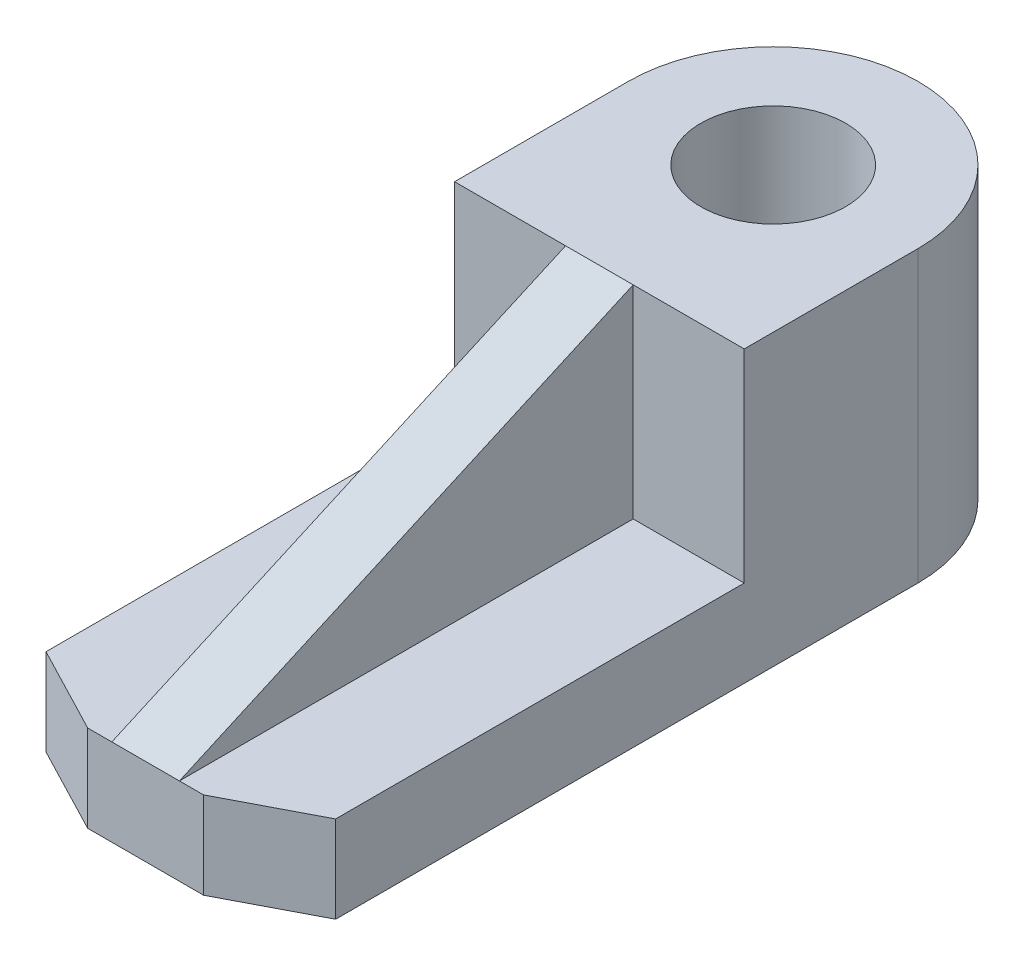
ISO-10303-21;
HEADER;
FILE_DESCRIPTION(('STEP AP214'),'2;1');
FILE_NAME('part.step','',(''),(''),'','','');
FILE_SCHEMA(('AUTOMOTIVE_DESIGN { 1 0 10303 214 1 1 1 1 }'));
ENDSEC;
DATA;
#1=APPLICATION_CONTEXT('core data for automotive mechanical design processes');
#2=APPLICATION_PROTOCOL_DEFINITION('international standard','automotive_design',2000,#1);
#3=PRODUCT_CONTEXT('',#1,'mechanical');
#4=PRODUCT('Part','Part','',(#3));
#5=PRODUCT_RELATED_PRODUCT_CATEGORY('part','',(#4));
#6=PRODUCT_DEFINITION_FORMATION('','',#4);
#7=PRODUCT_DEFINITION_CONTEXT('part definition',#1,'design');
#8=PRODUCT_DEFINITION('design','',#6,#7);
#9=PRODUCT_DEFINITION_SHAPE('','',#8);
#10=(LENGTH_UNIT() NAMED_UNIT(*) SI_UNIT(.MILLI.,.METRE.));
#11=(NAMED_UNIT(*) PLANE_ANGLE_UNIT() SI_UNIT($,.RADIAN.));
#12=(NAMED_UNIT(*) SI_UNIT($,.STERADIAN.) SOLID_ANGLE_UNIT());
#13=UNCERTAINTY_MEASURE_WITH_UNIT(LENGTH_MEASURE(1.E-05),#10,'distance_accuracy_value','');
#14=(GEOMETRIC_REPRESENTATION_CONTEXT(3) GLOBAL_UNCERTAINTY_ASSIGNED_CONTEXT((#13)) GLOBAL_UNIT_ASSIGNED_CONTEXT((#10,
#11,#12)) REPRESENTATION_CONTEXT('',''));
#15=CARTESIAN_POINT('',(0.,0.,0.));
#16=DIRECTION('',(0.,0.,1.));
#17=DIRECTION('',(1.,0.,0.));
#18=AXIS2_PLACEMENT_3D('',#15,#16,#17);
#19=CARTESIAN_POINT('',(0.992805755395675,9.,-65.));
#20=DIRECTION('',(0.,-1.,0.));
#21=DIRECTION('',(0.,0.,-1.));
#22=AXIS2_PLACEMENT_3D('',#19,#20,#21);
#23=PLANE('',#22);
#24=DIRECTION('',(0.,0.,-1.));
#25=VECTOR('',#24,1.);
#26=CARTESIAN_POINT('',(-2.50719424460432,9.,-47.));
#27=LINE('',#26,#25);
#28=CARTESIAN_POINT('',(-2.50719424460432,9.,0.));
#29=VERTEX_POINT('',#28);
#30=CARTESIAN_POINT('',(-2.50719424460432,9.,-47.));
#31=VERTEX_POINT('',#30);
#32=EDGE_CURVE('E235',#29,#31,#27,.T.);
#33=ORIENTED_EDGE('',*,*,#32,.T.);
#34=DIRECTION('',(1.,0.,0.));
#35=VECTOR('',#34,1.);
#36=CARTESIAN_POINT('',(0.,9.,-47.));
#37=LINE('',#36,#35);
#38=CARTESIAN_POINT('',(-14.0071942446043,9.,-47.));
#39=VERTEX_POINT('',#38);
#40=EDGE_CURVE('E62',#39,#31,#37,.T.);
#41=ORIENTED_EDGE('',*,*,#40,.F.);
#42=DIRECTION('',(0.,0.,1.));
#43=VECTOR('',#42,1.);
#44=CARTESIAN_POINT('',(-14.0071942446043,9.,-4.68345323741008));
#45=LINE('',#44,#43);
#46=CARTESIAN_POINT('',(-14.0071942446043,9.,-4.68345323741008));
#47=VERTEX_POINT('',#46);
#48=EDGE_CURVE('E170',#39,#47,#45,.T.);
#49=ORIENTED_EDGE('',*,*,#48,.T.);
#50=DIRECTION('',(0.88707744243177,0.,0.461620635510058));
#51=VECTOR('',#50,1.);
#52=CARTESIAN_POINT('',(-5.00719424460433,9.,0.));
#53=LINE('',#52,#51);
#54=CARTESIAN_POINT('',(-5.00719424460433,9.,0.));
#55=VERTEX_POINT('',#54);
#56=EDGE_CURVE('E159',#47,#55,#53,.T.);
#57=ORIENTED_EDGE('',*,*,#56,.T.);
#58=DIRECTION('',(1.,0.,0.));
#59=VECTOR('',#58,1.);
#60=CARTESIAN_POINT('',(-5.00719424460433,9.,0.));
#61=LINE('',#60,#59);
#62=EDGE_CURVE('E164',#55,#29,#61,.T.);
#63=ORIENTED_EDGE('',*,*,#62,.T.);
#64=EDGE_LOOP('',(#33,#41,#49,#57,#63));
#65=FACE_BOUND('',#64,.T.);
#66=ADVANCED_FACE('F39',(#65),#23,.F.);
#67=CARTESIAN_POINT('',(0.,30.,-47.));
#68=DIRECTION('',(0.,0.,-1.));
#69=DIRECTION('',(-1.,0.,0.));
#70=AXIS2_PLACEMENT_3D('',#67,#68,#69);
#71=PLANE('',#70);
#72=DIRECTION('',(0.,1.,0.));
#73=VECTOR('',#72,1.);
#74=CARTESIAN_POINT('',(-2.50719424460432,30.,-47.));
#75=LINE('',#74,#73);
#76=CARTESIAN_POINT('',(-2.50719424460432,30.,-47.));
#77=VERTEX_POINT('',#76);
#78=EDGE_CURVE('E234',#31,#77,#75,.T.);
#79=ORIENTED_EDGE('',*,*,#78,.T.);
#80=DIRECTION('',(1.,0.,0.));
#81=VECTOR('',#80,1.);
#82=CARTESIAN_POINT('',(0.,30.,-47.));
#83=LINE('',#82,#81);
#84=CARTESIAN_POINT('',(-14.0071942446043,30.,-47.));
#85=VERTEX_POINT('',#84);
#86=EDGE_CURVE('E224',#85,#77,#83,.T.);
#87=ORIENTED_EDGE('',*,*,#86,.F.);
#88=DIRECTION('',(0.,-1.,0.));
#89=VECTOR('',#88,1.);
#90=CARTESIAN_POINT('',(-14.0071942446043,30.,-47.));
#91=LINE('',#90,#89);
#92=EDGE_CURVE('E155',#85,#39,#91,.T.);
#93=ORIENTED_EDGE('',*,*,#92,.T.);
#94=ORIENTED_EDGE('',*,*,#40,.T.);
#95=EDGE_LOOP('',(#79,#87,#93,#94));
#96=FACE_BOUND('',#95,.T.);
#97=ADVANCED_FACE('F239',(#96),#71,.F.);
#98=CARTESIAN_POINT('',(4.49280575539568,9.,-47.));
#99=VERTEX_POINT('',#98);
#100=CARTESIAN_POINT('',(15.9928057553957,9.,-47.));
#101=VERTEX_POINT('',#100);
#102=EDGE_CURVE('E135',#99,#101,#37,.T.);
#103=ORIENTED_EDGE('',*,*,#102,.F.);
#104=DIRECTION('',(0.,0.,-1.));
#105=VECTOR('',#104,1.);
#106=CARTESIAN_POINT('',(4.49280575539568,9.,-47.));
#107=LINE('',#106,#105);
#108=CARTESIAN_POINT('',(4.49280575539568,9.,0.));
#109=VERTEX_POINT('',#108);
#110=EDGE_CURVE('E122',#109,#99,#107,.T.);
#111=ORIENTED_EDGE('',*,*,#110,.F.);
#112=CARTESIAN_POINT('',(6.99280575539568,9.,0.));
#113=VERTEX_POINT('',#112);
#114=EDGE_CURVE('E162',#109,#113,#61,.T.);
#115=ORIENTED_EDGE('',*,*,#114,.T.);
#116=DIRECTION('',(0.88707744243177,0.,-0.461620635510058));
#117=VECTOR('',#116,1.);
#118=CARTESIAN_POINT('',(6.99280575539568,9.,0.));
#119=LINE('',#118,#117);
#120=CARTESIAN_POINT('',(15.9928057553957,9.,-4.68345323741008));
#121=VERTEX_POINT('',#120);
#122=EDGE_CURVE('E167',#113,#121,#119,.T.);
#123=ORIENTED_EDGE('',*,*,#122,.T.);
#124=DIRECTION('',(0.,0.,-1.));
#125=VECTOR('',#124,1.);
#126=CARTESIAN_POINT('',(15.9928057553957,9.,-4.68345323741008));
#127=LINE('',#126,#125);
#128=EDGE_CURVE('E142',#121,#101,#127,.T.);
#129=ORIENTED_EDGE('',*,*,#128,.T.);
#130=EDGE_LOOP('',(#103,#111,#115,#123,#129));
#131=FACE_BOUND('',#130,.T.);
#132=ADVANCED_FACE('F140',(#131),#23,.F.);
#133=CARTESIAN_POINT('',(-5.00719424460433,9.,0.));
#134=DIRECTION('',(0.461620635510058,0.,-0.88707744243177));
#135=DIRECTION('',(-0.88707744243177,0.,-0.461620635510058));
#136=AXIS2_PLACEMENT_3D('',#133,#134,#135);
#137=PLANE('',#136);
#138=DIRECTION('',(0.88707744243177,0.,0.461620635510058));
#139=VECTOR('',#138,1.);
#140=CARTESIAN_POINT('',(-5.00719424460433,0.,0.));
#141=LINE('',#140,#139);
#142=CARTESIAN_POINT('',(-14.0071942446043,0.,-4.68345323741008));
#143=VERTEX_POINT('',#142);
#144=CARTESIAN_POINT('',(-5.00719424460433,0.,0.));
#145=VERTEX_POINT('',#144);
#146=EDGE_CURVE('E158',#143,#145,#141,.T.);
#147=ORIENTED_EDGE('',*,*,#146,.T.);
#148=DIRECTION('',(0.,-1.,0.));
#149=VECTOR('',#148,1.);
#150=CARTESIAN_POINT('',(-5.00719424460433,9.,0.));
#151=LINE('',#150,#149);
#152=EDGE_CURVE('E11',#55,#145,#151,.T.);
#153=ORIENTED_EDGE('',*,*,#152,.F.);
#154=ORIENTED_EDGE('',*,*,#56,.F.);
#155=DIRECTION('',(0.,-1.,0.));
#156=VECTOR('',#155,1.);
#157=CARTESIAN_POINT('',(-14.0071942446043,9.,-4.68345323741008));
#158=LINE('',#157,#156);
#159=EDGE_CURVE('E172',#47,#143,#158,.T.);
#160=ORIENTED_EDGE('',*,*,#159,.T.);
#161=EDGE_LOOP('',(#147,#153,#154,#160));
#162=FACE_BOUND('',#161,.T.);
#163=ADVANCED_FACE('F41',(#162),#137,.F.);
#164=CARTESIAN_POINT('',(-5.00719424460433,9.,0.));
#165=DIRECTION('',(0.,0.,-1.));
#166=DIRECTION('',(-1.,0.,0.));
#167=AXIS2_PLACEMENT_3D('',#164,#165,#166);
#168=PLANE('',#167);
#169=DIRECTION('',(1.,0.,0.));
#170=VECTOR('',#169,1.);
#171=CARTESIAN_POINT('',(-5.00719424460433,0.,0.));
#172=LINE('',#171,#170);
#173=CARTESIAN_POINT('',(6.99280575539568,0.,0.));
#174=VERTEX_POINT('',#173);
#175=EDGE_CURVE('E175',#145,#174,#172,.T.);
#176=ORIENTED_EDGE('',*,*,#175,.T.);
#177=DIRECTION('',(0.,-1.,0.));
#178=VECTOR('',#177,1.);
#179=CARTESIAN_POINT('',(6.99280575539568,9.,0.));
#180=LINE('',#179,#178);
#181=EDGE_CURVE('E47',#113,#174,#180,.T.);
#182=ORIENTED_EDGE('',*,*,#181,.F.);
#183=ORIENTED_EDGE('',*,*,#114,.F.);
#184=DIRECTION('',(-1.,0.,0.));
#185=VECTOR('',#184,1.);
#186=CARTESIAN_POINT('',(4.49280575539568,9.,0.));
#187=LINE('',#186,#185);
#188=EDGE_CURVE('E147',#109,#29,#187,.T.);
#189=ORIENTED_EDGE('',*,*,#188,.T.);
#190=ORIENTED_EDGE('',*,*,#62,.F.);
#191=ORIENTED_EDGE('',*,*,#152,.T.);
#192=EDGE_LOOP('',(#176,#182,#183,#189,#190,#191));
#193=FACE_BOUND('',#192,.T.);
#194=ADVANCED_FACE('F271',(#193),#168,.F.);
#195=CARTESIAN_POINT('',(6.99280575539568,9.,0.));
#196=DIRECTION('',(-0.461620635510058,0.,-0.88707744243177));
#197=DIRECTION('',(-0.88707744243177,0.,0.461620635510059));
#198=AXIS2_PLACEMENT_3D('',#195,#196,#197);
#199=PLANE('',#198);
#200=DIRECTION('',(0.88707744243177,0.,-0.461620635510058));
#201=VECTOR('',#200,1.);
#202=CARTESIAN_POINT('',(6.99280575539568,0.,0.));
#203=LINE('',#202,#201);
#204=CARTESIAN_POINT('',(15.9928057553957,0.,-4.68345323741008));
#205=VERTEX_POINT('',#204);
#206=EDGE_CURVE('E177',#174,#205,#203,.T.);
#207=ORIENTED_EDGE('',*,*,#206,.T.);
#208=DIRECTION('',(0.,-1.,0.));
#209=VECTOR('',#208,1.);
#210=CARTESIAN_POINT('',(15.9928057553957,9.,-4.68345323741008));
#211=LINE('',#210,#209);
#212=EDGE_CURVE('E192',#121,#205,#211,.T.);
#213=ORIENTED_EDGE('',*,*,#212,.F.);
#214=ORIENTED_EDGE('',*,*,#122,.F.);
#215=ORIENTED_EDGE('',*,*,#181,.T.);
#216=EDGE_LOOP('',(#207,#213,#214,#215));
#217=FACE_BOUND('',#216,.T.);
#218=ADVANCED_FACE('F199',(#217),#199,.F.);
#219=CARTESIAN_POINT('',(15.9928057553957,9.,-4.68345323741008));
#220=DIRECTION('',(-1.,0.,0.));
#221=DIRECTION('',(0.,0.,1.));
#222=AXIS2_PLACEMENT_3D('',#219,#220,#221);
#223=PLANE('',#222);
#224=DIRECTION('',(0.,0.,-1.));
#225=VECTOR('',#224,1.);
#226=CARTESIAN_POINT('',(15.9928057553957,0.,-4.68345323741008));
#227=LINE('',#226,#225);
#228=CARTESIAN_POINT('',(15.9928057553957,0.,-65.));
#229=VERTEX_POINT('',#228);
#230=EDGE_CURVE('E179',#205,#229,#227,.T.);
#231=ORIENTED_EDGE('',*,*,#230,.T.);
#232=DIRECTION('',(0.,-1.,0.));
#233=VECTOR('',#232,1.);
#234=CARTESIAN_POINT('',(15.9928057553957,9.,-65.));
#235=LINE('',#234,#233);
#236=CARTESIAN_POINT('',(15.9928057553957,30.,-65.));
#237=VERTEX_POINT('',#236);
#238=EDGE_CURVE('E189',#237,#229,#235,.T.);
#239=ORIENTED_EDGE('',*,*,#238,.F.);
#240=DIRECTION('',(0.,0.,-1.));
#241=VECTOR('',#240,1.);
#242=CARTESIAN_POINT('',(15.9928057553957,30.,0.));
#243=LINE('',#242,#241);
#244=CARTESIAN_POINT('',(15.9928057553957,30.,-47.));
#245=VERTEX_POINT('',#244);
#246=EDGE_CURVE('E151',#245,#237,#243,.T.);
#247=ORIENTED_EDGE('',*,*,#246,.F.);
#248=DIRECTION('',(0.,-1.,0.));
#249=VECTOR('',#248,1.);
#250=CARTESIAN_POINT('',(15.9928057553957,30.,-47.));
#251=LINE('',#250,#249);
#252=EDGE_CURVE('E153',#245,#101,#251,.T.);
#253=ORIENTED_EDGE('',*,*,#252,.T.);
#254=ORIENTED_EDGE('',*,*,#128,.F.);
#255=ORIENTED_EDGE('',*,*,#212,.T.);
#256=EDGE_LOOP('',(#231,#239,#247,#253,#254,#255));
#257=FACE_BOUND('',#256,.T.);
#258=ADVANCED_FACE('F209',(#257),#223,.F.);
#259=CARTESIAN_POINT('',(0.992805755395675,9.,-65.));
#260=DIRECTION('',(0.,-1.,0.));
#261=DIRECTION('',(0.,0.,-1.));
#262=AXIS2_PLACEMENT_3D('',#259,#260,#261);
#263=CYLINDRICAL_SURFACE('',#262,15.);
#264=CARTESIAN_POINT('',(0.992805755395675,0.,-65.));
#265=DIRECTION('',(0.,1.,0.));
#266=DIRECTION('',(0.,0.,-1.));
#267=AXIS2_PLACEMENT_3D('',#264,#265,#266);
#268=CIRCLE('',#267,15.);
#269=CARTESIAN_POINT('',(-14.0071942446043,0.,-65.));
#270=VERTEX_POINT('',#269);
#271=EDGE_CURVE('E181',#229,#270,#268,.T.);
#272=ORIENTED_EDGE('',*,*,#271,.T.);
#273=DIRECTION('',(0.,-1.,0.));
#274=VECTOR('',#273,1.);
#275=CARTESIAN_POINT('',(-14.0071942446043,9.,-65.));
#276=LINE('',#275,#274);
#277=CARTESIAN_POINT('',(-14.0071942446043,30.,-65.));
#278=VERTEX_POINT('',#277);
#279=EDGE_CURVE('E186',#278,#270,#276,.T.);
#280=ORIENTED_EDGE('',*,*,#279,.F.);
#281=CARTESIAN_POINT('',(0.992805755395675,30.,-65.));
#282=DIRECTION('',(0.,1.,0.));
#283=DIRECTION('',(0.,0.,1.));
#284=AXIS2_PLACEMENT_3D('',#281,#282,#283);
#285=CIRCLE('',#284,15.);
#286=EDGE_CURVE('E216',#237,#278,#285,.T.);
#287=ORIENTED_EDGE('',*,*,#286,.F.);
#288=ORIENTED_EDGE('',*,*,#238,.T.);
#289=EDGE_LOOP('',(#272,#280,#287,#288));
#290=FACE_BOUND('',#289,.T.);
#291=ADVANCED_FACE('F214',(#290),#263,.T.);
#292=CARTESIAN_POINT('',(-14.0071942446043,9.,-4.68345323741008));
#293=DIRECTION('',(1.,0.,0.));
#294=DIRECTION('',(0.,0.,-1.));
#295=AXIS2_PLACEMENT_3D('',#292,#293,#294);
#296=PLANE('',#295);
#297=DIRECTION('',(0.,0.,1.));
#298=VECTOR('',#297,1.);
#299=CARTESIAN_POINT('',(-14.0071942446043,0.,-4.68345323741008));
#300=LINE('',#299,#298);
#301=EDGE_CURVE('E163',#270,#143,#300,.T.);
#302=ORIENTED_EDGE('',*,*,#301,.T.);
#303=ORIENTED_EDGE('',*,*,#159,.F.);
#304=ORIENTED_EDGE('',*,*,#48,.F.);
#305=ORIENTED_EDGE('',*,*,#92,.F.);
#306=DIRECTION('',(0.,0.,1.));
#307=VECTOR('',#306,1.);
#308=CARTESIAN_POINT('',(-14.0071942446043,30.,0.));
#309=LINE('',#308,#307);
#310=EDGE_CURVE('E219',#278,#85,#309,.T.);
#311=ORIENTED_EDGE('',*,*,#310,.F.);
#312=ORIENTED_EDGE('',*,*,#279,.T.);
#313=EDGE_LOOP('',(#302,#303,#304,#305,#311,#312));
#314=FACE_BOUND('',#313,.T.);
#315=ADVANCED_FACE('F280',(#314),#296,.F.);
#316=CARTESIAN_POINT('',(0.992805755395675,0.,-65.));
#317=DIRECTION('',(0.,-1.,0.));
#318=DIRECTION('',(0.,0.,-1.));
#319=AXIS2_PLACEMENT_3D('',#316,#317,#318);
#320=PLANE('',#319);
#321=CARTESIAN_POINT('',(0.992805755395674,0.,-65.));
#322=DIRECTION('',(0.,1.,0.));
#323=DIRECTION('',(0.,0.,1.));
#324=AXIS2_PLACEMENT_3D('',#321,#322,#323);
#325=CIRCLE('',#324,7.5);
#326=CARTESIAN_POINT('',(0.992805755395674,0.,-72.5));
#327=VERTEX_POINT('',#326);
#328=EDGE_CURVE('E241',#327,#327,#325,.T.);
#329=ORIENTED_EDGE('',*,*,#328,.T.);
#330=EDGE_LOOP('',(#329));
#331=FACE_BOUND('',#330,.T.);
#332=ORIENTED_EDGE('',*,*,#146,.F.);
#333=ORIENTED_EDGE('',*,*,#301,.F.);
#334=ORIENTED_EDGE('',*,*,#271,.F.);
#335=ORIENTED_EDGE('',*,*,#230,.F.);
#336=ORIENTED_EDGE('',*,*,#206,.F.);
#337=ORIENTED_EDGE('',*,*,#175,.F.);
#338=EDGE_LOOP('',(#332,#333,#334,#335,#336,#337));
#339=FACE_BOUND('',#338,.T.);
#340=ADVANCED_FACE('F205',(#331,#339),#320,.T.);
#341=CARTESIAN_POINT('',(4.49280575539568,30.,-47.));
#342=VERTEX_POINT('',#341);
#343=EDGE_CURVE('E137',#342,#245,#83,.T.);
#344=ORIENTED_EDGE('',*,*,#343,.F.);
#345=DIRECTION('',(0.,1.,0.));
#346=VECTOR('',#345,1.);
#347=CARTESIAN_POINT('',(4.49280575539568,30.,-47.));
#348=LINE('',#347,#346);
#349=EDGE_CURVE('E125',#99,#342,#348,.T.);
#350=ORIENTED_EDGE('',*,*,#349,.F.);
#351=ORIENTED_EDGE('',*,*,#102,.T.);
#352=ORIENTED_EDGE('',*,*,#252,.F.);
#353=EDGE_LOOP('',(#344,#350,#351,#352));
#354=FACE_BOUND('',#353,.T.);
#355=ADVANCED_FACE('F133',(#354),#71,.F.);
#356=CARTESIAN_POINT('',(0.992805755395674,30.,-65.));
#357=DIRECTION('',(0.,-1.,0.));
#358=DIRECTION('',(0.,0.,-1.));
#359=AXIS2_PLACEMENT_3D('',#356,#357,#358);
#360=CYLINDRICAL_SURFACE('',#359,7.5);
#361=CARTESIAN_POINT('',(0.992805755395674,30.,-65.));
#362=DIRECTION('',(0.,1.,0.));
#363=DIRECTION('',(0.,0.,1.));
#364=AXIS2_PLACEMENT_3D('',#361,#362,#363);
#365=CIRCLE('',#364,7.5);
#366=CARTESIAN_POINT('',(0.992805755395674,30.,-72.5));
#367=VERTEX_POINT('',#366);
#368=EDGE_CURVE('E146',#367,#367,#365,.T.);
#369=CARTESIAN_POINT('',(0.992805755395674,30.,-72.5));
#370=CARTESIAN_POINT('',(0.992805755395674,29.6875,-72.5));
#371=CARTESIAN_POINT('',(0.992805755395674,29.375,-72.5));
#372=CARTESIAN_POINT('',(0.992805755395674,28.75,-72.5));
#373=CARTESIAN_POINT('',(0.992805755395674,28.4375,-72.5));
#374=CARTESIAN_POINT('',(0.992805755395674,27.8125,-72.5));
#375=CARTESIAN_POINT('',(0.992805755395674,27.5,-72.5));
#376=CARTESIAN_POINT('',(0.992805755395674,26.875,-72.5));
#377=CARTESIAN_POINT('',(0.992805755395674,26.5625,-72.5));
#378=CARTESIAN_POINT('',(0.992805755395674,25.9375,-72.5));
#379=CARTESIAN_POINT('',(0.992805755395674,25.625,-72.5));
#380=CARTESIAN_POINT('',(0.992805755395674,25.,-72.5));
#381=CARTESIAN_POINT('',(0.992805755395674,24.6875,-72.5));
#382=CARTESIAN_POINT('',(0.992805755395674,24.0625,-72.5));
#383=CARTESIAN_POINT('',(0.992805755395674,23.75,-72.5));
#384=CARTESIAN_POINT('',(0.992805755395674,23.125,-72.5));
#385=CARTESIAN_POINT('',(0.992805755395674,22.8125,-72.5));
#386=CARTESIAN_POINT('',(0.992805755395674,22.1875,-72.5));
#387=CARTESIAN_POINT('',(0.992805755395674,21.875,-72.5));
#388=CARTESIAN_POINT('',(0.992805755395674,21.25,-72.5));
#389=CARTESIAN_POINT('',(0.992805755395674,20.9375,-72.5));
#390=CARTESIAN_POINT('',(0.992805755395674,20.3125,-72.5));
#391=CARTESIAN_POINT('',(0.992805755395674,20.,-72.5));
#392=CARTESIAN_POINT('',(0.992805755395674,19.375,-72.5));
#393=CARTESIAN_POINT('',(0.992805755395674,19.0625,-72.5));
#394=CARTESIAN_POINT('',(0.992805755395674,18.4375,-72.5));
#395=CARTESIAN_POINT('',(0.992805755395674,18.125,-72.5));
#396=CARTESIAN_POINT('',(0.992805755395674,17.5,-72.5));
#397=CARTESIAN_POINT('',(0.992805755395674,17.1875,-72.5));
#398=CARTESIAN_POINT('',(0.992805755395674,16.5625,-72.5));
#399=CARTESIAN_POINT('',(0.992805755395674,16.25,-72.5));
#400=CARTESIAN_POINT('',(0.992805755395674,15.625,-72.5));
#401=CARTESIAN_POINT('',(0.992805755395674,15.3125,-72.5));
#402=CARTESIAN_POINT('',(0.992805755395674,14.6875,-72.5));
#403=CARTESIAN_POINT('',(0.992805755395674,14.375,-72.5));
#404=CARTESIAN_POINT('',(0.992805755395674,13.75,-72.5));
#405=CARTESIAN_POINT('',(0.992805755395674,13.4375,-72.5));
#406=CARTESIAN_POINT('',(0.992805755395674,12.8125,-72.5));
#407=CARTESIAN_POINT('',(0.992805755395674,12.5,-72.5));
#408=CARTESIAN_POINT('',(0.992805755395674,11.875,-72.5));
#409=CARTESIAN_POINT('',(0.992805755395674,11.5625,-72.5));
#410=CARTESIAN_POINT('',(0.992805755395674,10.9375,-72.5));
#411=CARTESIAN_POINT('',(0.992805755395674,10.625,-72.5));
#412=CARTESIAN_POINT('',(0.992805755395674,10.,-72.5));
#413=CARTESIAN_POINT('',(0.992805755395674,9.6875,-72.5));
#414=CARTESIAN_POINT('',(0.992805755395674,9.0625,-72.5));
#415=CARTESIAN_POINT('',(0.992805755395674,8.75,-72.5));
#416=CARTESIAN_POINT('',(0.992805755395674,8.125,-72.5));
#417=CARTESIAN_POINT('',(0.992805755395674,7.8125,-72.5));
#418=CARTESIAN_POINT('',(0.992805755395674,7.1875,-72.5));
#419=CARTESIAN_POINT('',(0.992805755395674,6.875,-72.5));
#420=CARTESIAN_POINT('',(0.992805755395674,6.25,-72.5));
#421=CARTESIAN_POINT('',(0.992805755395674,5.9375,-72.5));
#422=CARTESIAN_POINT('',(0.992805755395674,5.3125,-72.5));
#423=CARTESIAN_POINT('',(0.992805755395674,5.,-72.5));
#424=CARTESIAN_POINT('',(0.992805755395674,4.375,-72.5));
#425=CARTESIAN_POINT('',(0.992805755395674,4.0625,-72.5));
#426=CARTESIAN_POINT('',(0.992805755395674,3.4375,-72.5));
#427=CARTESIAN_POINT('',(0.992805755395674,3.125,-72.5));
#428=CARTESIAN_POINT('',(0.992805755395674,2.5,-72.5));
#429=CARTESIAN_POINT('',(0.992805755395674,2.1875,-72.5));
#430=CARTESIAN_POINT('',(0.992805755395674,1.5625,-72.5));
#431=CARTESIAN_POINT('',(0.992805755395674,1.25,-72.5));
#432=CARTESIAN_POINT('',(0.992805755395674,0.624999999999997,-72.5));
#433=CARTESIAN_POINT('',(0.992805755395674,0.312499999999997,-72.5));
#434=CARTESIAN_POINT('',(0.992805755395674,0.,-72.5));
#435=B_SPLINE_CURVE_WITH_KNOTS('',3,(#369,#370,#371,#372,#373,#374,#375,#376,#377,#378,#379,
#380,#381,#382,#383,#384,#385,#386,#387,#388,#389,#390,#391,#392,#393,#394,#395,#396,#397,#398,
#399,#400,#401,#402,#403,#404,#405,#406,#407,#408,#409,#410,#411,#412,#413,#414,#415,#416,#417,
#418,#419,#420,#421,#422,#423,#424,#425,#426,#427,#428,#429,#430,#431,#432,#433,#434),
.UNSPECIFIED.,.F.,.F.,(4,2,2,2,2,2,2,2,2,2,2,2,2,2,2,2,2,2,2,2,2,2,2,2,2,2,2,2,2,2,2,2,4),(0.,
0.937499999999997,1.875,2.8125,3.75,4.6875,5.625,6.5625,7.5,8.4375,9.375,10.3125,11.25,12.1875,
13.125,14.0625,15.,15.9375,16.875,17.8125,18.75,19.6875,20.625,21.5625,22.5,23.4375,24.375,
25.3125,26.25,27.1875,28.125,29.0625,30.),.UNSPECIFIED.);
#436=EDGE_CURVE('BSEAM250',#367,#327,#435,.T.);
#437=ORIENTED_EDGE('',*,*,#368,.T.);
#438=ORIENTED_EDGE('',*,*,#328,.F.);
#439=ORIENTED_EDGE('',*,*,#436,.T.);
#440=ORIENTED_EDGE('',*,*,#436,.F.);
#441=EDGE_LOOP('',(#437,#439,#438,#440));
#442=FACE_BOUND('',#441,.T.);
#443=ADVANCED_FACE('F250',(#442),#360,.F.);
#444=CARTESIAN_POINT('',(0.,30.,0.));
#445=DIRECTION('',(0.,1.,0.));
#446=DIRECTION('',(0.,0.,1.));
#447=AXIS2_PLACEMENT_3D('',#444,#445,#446);
#448=PLANE('',#447);
#449=ORIENTED_EDGE('',*,*,#368,.F.);
#450=EDGE_LOOP('',(#449));
#451=FACE_BOUND('',#450,.T.);
#452=ORIENTED_EDGE('',*,*,#286,.T.);
#453=ORIENTED_EDGE('',*,*,#310,.T.);
#454=ORIENTED_EDGE('',*,*,#86,.T.);
#455=DIRECTION('',(-1.,0.,0.));
#456=VECTOR('',#455,1.);
#457=CARTESIAN_POINT('',(4.49280575539568,30.,-47.));
#458=LINE('',#457,#456);
#459=EDGE_CURVE('E144',#342,#77,#458,.T.);
#460=ORIENTED_EDGE('',*,*,#459,.F.);
#461=ORIENTED_EDGE('',*,*,#343,.T.);
#462=ORIENTED_EDGE('',*,*,#246,.T.);
#463=EDGE_LOOP('',(#452,#453,#454,#460,#461,#462));
#464=FACE_BOUND('',#463,.T.);
#465=ADVANCED_FACE('F227',(#451,#464),#448,.T.);
#466=CARTESIAN_POINT('',(4.49280575539568,9.,0.));
#467=DIRECTION('',(0.,-0.913008710615828,-0.407940062190051));
#468=DIRECTION('',(0.,0.407940062190051,-0.913008710615828));
#469=AXIS2_PLACEMENT_3D('',#466,#467,#468);
#470=PLANE('',#469);
#471=DIRECTION('',(0.,-0.407940062190051,0.913008710615828));
#472=VECTOR('',#471,1.);
#473=CARTESIAN_POINT('',(-2.50719424460432,9.,0.));
#474=LINE('',#473,#472);
#475=EDGE_CURVE('E130',#77,#29,#474,.T.);
#476=ORIENTED_EDGE('',*,*,#475,.T.);
#477=ORIENTED_EDGE('',*,*,#188,.F.);
#478=DIRECTION('',(0.,-0.407940062190051,0.913008710615828));
#479=VECTOR('',#478,1.);
#480=CARTESIAN_POINT('',(4.49280575539568,9.,0.));
#481=LINE('',#480,#479);
#482=EDGE_CURVE('E54',#342,#109,#481,.T.);
#483=ORIENTED_EDGE('',*,*,#482,.F.);
#484=ORIENTED_EDGE('',*,*,#459,.T.);
#485=EDGE_LOOP('',(#476,#477,#483,#484));
#486=FACE_BOUND('',#485,.T.);
#487=ADVANCED_FACE('F229',(#486),#470,.F.);
#488=CARTESIAN_POINT('',(4.49280575539568,0.,0.));
#489=DIRECTION('',(1.,0.,0.));
#490=DIRECTION('',(0.,0.,-1.));
#491=AXIS2_PLACEMENT_3D('',#488,#489,#490);
#492=PLANE('',#491);
#493=ORIENTED_EDGE('',*,*,#110,.T.);
#494=ORIENTED_EDGE('',*,*,#349,.T.);
#495=ORIENTED_EDGE('',*,*,#482,.T.);
#496=EDGE_LOOP('',(#493,#494,#495));
#497=FACE_BOUND('',#496,.T.);
#498=ADVANCED_FACE('F124',(#497),#492,.T.);
#499=CARTESIAN_POINT('',(-2.50719424460432,0.,0.));
#500=DIRECTION('',(1.,0.,0.));
#501=DIRECTION('',(0.,0.,-1.));
#502=AXIS2_PLACEMENT_3D('',#499,#500,#501);
#503=PLANE('',#502);
#504=ORIENTED_EDGE('',*,*,#32,.F.);
#505=ORIENTED_EDGE('',*,*,#475,.F.);
#506=ORIENTED_EDGE('',*,*,#78,.F.);
#507=EDGE_LOOP('',(#504,#505,#506));
#508=FACE_BOUND('',#507,.T.);
#509=ADVANCED_FACE('F233',(#508),#503,.F.);
#510=CLOSED_SHELL('',(#66,#97,#132,#163,#194,#218,#258,#291,#315,#340,#355,#443,#465,#487,#498,#509));
#511=MANIFOLD_SOLID_BREP('B2',#510);
#512=ADVANCED_BREP_SHAPE_REPRESENTATION('',(#18,#511),#14);
#513=SHAPE_DEFINITION_REPRESENTATION(#9,#512);
ENDSEC;
END-ISO-10303-21;
